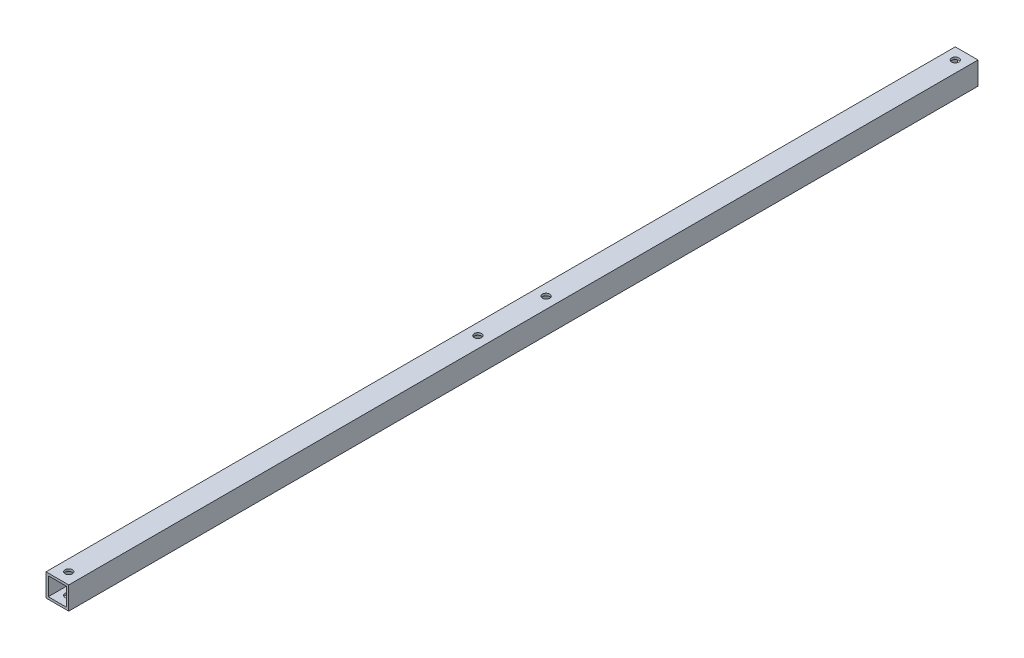
ISO-10303-21;
HEADER;
FILE_DESCRIPTION(('STEP AP214'),'2;1');
FILE_NAME('part.step','',(''),(''),'','','');
FILE_SCHEMA(('AUTOMOTIVE_DESIGN { 1 0 10303 214 1 1 1 1 }'));
ENDSEC;
DATA;
#1=APPLICATION_CONTEXT('core data for automotive mechanical design processes');
#2=APPLICATION_PROTOCOL_DEFINITION('international standard','automotive_design',2000,#1);
#3=PRODUCT_CONTEXT('',#1,'mechanical');
#4=PRODUCT('Part','Part','',(#3));
#5=PRODUCT_RELATED_PRODUCT_CATEGORY('part','',(#4));
#6=PRODUCT_DEFINITION_FORMATION('','',#4);
#7=PRODUCT_DEFINITION_CONTEXT('part definition',#1,'design');
#8=PRODUCT_DEFINITION('design','',#6,#7);
#9=PRODUCT_DEFINITION_SHAPE('','',#8);
#10=(LENGTH_UNIT() NAMED_UNIT(*) SI_UNIT(.MILLI.,.METRE.));
#11=(NAMED_UNIT(*) PLANE_ANGLE_UNIT() SI_UNIT($,.RADIAN.));
#12=(NAMED_UNIT(*) SI_UNIT($,.STERADIAN.) SOLID_ANGLE_UNIT());
#13=UNCERTAINTY_MEASURE_WITH_UNIT(LENGTH_MEASURE(1.E-05),#10,'distance_accuracy_value','');
#14=(GEOMETRIC_REPRESENTATION_CONTEXT(3) GLOBAL_UNCERTAINTY_ASSIGNED_CONTEXT((#13)) GLOBAL_UNIT_ASSIGNED_CONTEXT((#10,
#11,#12)) REPRESENTATION_CONTEXT('',''));
#15=CARTESIAN_POINT('',(0.,0.,0.));
#16=DIRECTION('',(0.,0.,1.));
#17=DIRECTION('',(1.,0.,0.));
#18=AXIS2_PLACEMENT_3D('',#15,#16,#17);
#19=CARTESIAN_POINT('',(0.,0.,399.7114317));
#20=DIRECTION('',(0.,0.,1.));
#21=DIRECTION('',(1.,0.,0.));
#22=AXIS2_PLACEMENT_3D('',#19,#20,#21);
#23=PLANE('',#22);
#24=DIRECTION('',(0.,1.,0.));
#25=VECTOR('',#24,1.);
#26=CARTESIAN_POINT('',(5.,5.,399.7114317));
#27=LINE('',#26,#25);
#28=CARTESIAN_POINT('',(5.,-5.,399.7114317));
#29=VERTEX_POINT('',#28);
#30=CARTESIAN_POINT('',(5.,5.,399.7114317));
#31=VERTEX_POINT('',#30);
#32=EDGE_CURVE('E138',#29,#31,#27,.T.);
#33=ORIENTED_EDGE('',*,*,#32,.T.);
#34=DIRECTION('',(-1.,0.,0.));
#35=VECTOR('',#34,1.);
#36=CARTESIAN_POINT('',(-5.,5.,399.7114317));
#37=LINE('',#36,#35);
#38=CARTESIAN_POINT('',(-5.,5.,399.7114317));
#39=VERTEX_POINT('',#38);
#40=EDGE_CURVE('E141',#31,#39,#37,.T.);
#41=ORIENTED_EDGE('',*,*,#40,.T.);
#42=DIRECTION('',(0.,-1.,0.));
#43=VECTOR('',#42,1.);
#44=CARTESIAN_POINT('',(-5.,5.,399.7114317));
#45=LINE('',#44,#43);
#46=CARTESIAN_POINT('',(-5.,-5.,399.7114317));
#47=VERTEX_POINT('',#46);
#48=EDGE_CURVE('E144',#39,#47,#45,.T.);
#49=ORIENTED_EDGE('',*,*,#48,.T.);
#50=DIRECTION('',(1.,0.,0.));
#51=VECTOR('',#50,1.);
#52=CARTESIAN_POINT('',(-5.,-5.,399.7114317));
#53=LINE('',#52,#51);
#54=EDGE_CURVE('E146',#47,#29,#53,.T.);
#55=ORIENTED_EDGE('',*,*,#54,.T.);
#56=EDGE_LOOP('',(#33,#41,#49,#55));
#57=FACE_BOUND('',#56,.T.);
#58=DIRECTION('',(0.,-1.,0.));
#59=VECTOR('',#58,1.);
#60=CARTESIAN_POINT('',(-4.,4.,399.7114317));
#61=LINE('',#60,#59);
#62=CARTESIAN_POINT('',(-4.,4.,399.7114317));
#63=VERTEX_POINT('',#62);
#64=CARTESIAN_POINT('',(-4.,-4.,399.7114317));
#65=VERTEX_POINT('',#64);
#66=EDGE_CURVE('E108',#63,#65,#61,.T.);
#67=ORIENTED_EDGE('',*,*,#66,.F.);
#68=DIRECTION('',(-1.,0.,0.));
#69=VECTOR('',#68,1.);
#70=CARTESIAN_POINT('',(-4.,4.,399.7114317));
#71=LINE('',#70,#69);
#72=CARTESIAN_POINT('',(4.,4.,399.7114317));
#73=VERTEX_POINT('',#72);
#74=EDGE_CURVE('E100',#73,#63,#71,.T.);
#75=ORIENTED_EDGE('',*,*,#74,.F.);
#76=DIRECTION('',(0.,1.,0.));
#77=VECTOR('',#76,1.);
#78=CARTESIAN_POINT('',(4.,4.,399.7114317));
#79=LINE('',#78,#77);
#80=CARTESIAN_POINT('',(4.,-4.,399.7114317));
#81=VERTEX_POINT('',#80);
#82=EDGE_CURVE('E122',#81,#73,#79,.T.);
#83=ORIENTED_EDGE('',*,*,#82,.F.);
#84=DIRECTION('',(1.,0.,0.));
#85=VECTOR('',#84,1.);
#86=CARTESIAN_POINT('',(-4.,-4.,399.7114317));
#87=LINE('',#86,#85);
#88=EDGE_CURVE('E120',#65,#81,#87,.T.);
#89=ORIENTED_EDGE('',*,*,#88,.F.);
#90=EDGE_LOOP('',(#67,#75,#83,#89));
#91=FACE_BOUND('',#90,.T.);
#92=ADVANCED_FACE('F33',(#57,#91),#23,.T.);
#93=CARTESIAN_POINT('',(0.,0.,0.));
#94=DIRECTION('',(0.,0.,1.));
#95=DIRECTION('',(1.,0.,0.));
#96=AXIS2_PLACEMENT_3D('',#93,#94,#95);
#97=PLANE('',#96);
#98=DIRECTION('',(0.,1.,0.));
#99=VECTOR('',#98,1.);
#100=CARTESIAN_POINT('',(5.,5.,0.));
#101=LINE('',#100,#99);
#102=CARTESIAN_POINT('',(5.,-5.,0.));
#103=VERTEX_POINT('',#102);
#104=CARTESIAN_POINT('',(5.,5.,0.));
#105=VERTEX_POINT('',#104);
#106=EDGE_CURVE('E116',#103,#105,#101,.T.);
#107=ORIENTED_EDGE('',*,*,#106,.F.);
#108=DIRECTION('',(1.,0.,0.));
#109=VECTOR('',#108,1.);
#110=CARTESIAN_POINT('',(-5.,-5.,0.));
#111=LINE('',#110,#109);
#112=CARTESIAN_POINT('',(-5.,-5.,0.));
#113=VERTEX_POINT('',#112);
#114=EDGE_CURVE('E142',#113,#103,#111,.T.);
#115=ORIENTED_EDGE('',*,*,#114,.F.);
#116=DIRECTION('',(0.,-1.,0.));
#117=VECTOR('',#116,1.);
#118=CARTESIAN_POINT('',(-5.,5.,0.));
#119=LINE('',#118,#117);
#120=CARTESIAN_POINT('',(-5.,5.,0.));
#121=VERTEX_POINT('',#120);
#122=EDGE_CURVE('E153',#121,#113,#119,.T.);
#123=ORIENTED_EDGE('',*,*,#122,.F.);
#124=DIRECTION('',(-1.,0.,0.));
#125=VECTOR('',#124,1.);
#126=CARTESIAN_POINT('',(-5.,5.,0.));
#127=LINE('',#126,#125);
#128=EDGE_CURVE('E151',#105,#121,#127,.T.);
#129=ORIENTED_EDGE('',*,*,#128,.F.);
#130=EDGE_LOOP('',(#107,#115,#123,#129));
#131=FACE_BOUND('',#130,.T.);
#132=DIRECTION('',(-1.,0.,0.));
#133=VECTOR('',#132,1.);
#134=CARTESIAN_POINT('',(-4.,4.,0.));
#135=LINE('',#134,#133);
#136=CARTESIAN_POINT('',(4.,4.,0.));
#137=VERTEX_POINT('',#136);
#138=CARTESIAN_POINT('',(-4.,4.,0.));
#139=VERTEX_POINT('',#138);
#140=EDGE_CURVE('E58',#137,#139,#135,.T.);
#141=ORIENTED_EDGE('',*,*,#140,.T.);
#142=DIRECTION('',(0.,-1.,0.));
#143=VECTOR('',#142,1.);
#144=CARTESIAN_POINT('',(-4.,4.,0.));
#145=LINE('',#144,#143);
#146=CARTESIAN_POINT('',(-4.,-4.,0.));
#147=VERTEX_POINT('',#146);
#148=EDGE_CURVE('E115',#139,#147,#145,.T.);
#149=ORIENTED_EDGE('',*,*,#148,.T.);
#150=DIRECTION('',(1.,0.,0.));
#151=VECTOR('',#150,1.);
#152=CARTESIAN_POINT('',(-4.,-4.,0.));
#153=LINE('',#152,#151);
#154=CARTESIAN_POINT('',(4.,-4.,0.));
#155=VERTEX_POINT('',#154);
#156=EDGE_CURVE('E130',#147,#155,#153,.T.);
#157=ORIENTED_EDGE('',*,*,#156,.T.);
#158=DIRECTION('',(0.,1.,0.));
#159=VECTOR('',#158,1.);
#160=CARTESIAN_POINT('',(4.,4.,0.));
#161=LINE('',#160,#159);
#162=EDGE_CURVE('E109',#155,#137,#161,.T.);
#163=ORIENTED_EDGE('',*,*,#162,.T.);
#164=EDGE_LOOP('',(#141,#149,#157,#163));
#165=FACE_BOUND('',#164,.T.);
#166=ADVANCED_FACE('F222',(#131,#165),#97,.F.);
#167=CARTESIAN_POINT('',(5.,5.,399.7114317));
#168=DIRECTION('',(-1.,0.,0.));
#169=DIRECTION('',(0.,-1.,0.));
#170=AXIS2_PLACEMENT_3D('',#167,#168,#169);
#171=PLANE('',#170);
#172=ORIENTED_EDGE('',*,*,#106,.T.);
#173=DIRECTION('',(0.,0.,-1.));
#174=VECTOR('',#173,1.);
#175=CARTESIAN_POINT('',(5.,5.,399.7114317));
#176=LINE('',#175,#174);
#177=EDGE_CURVE('E11',#31,#105,#176,.T.);
#178=ORIENTED_EDGE('',*,*,#177,.F.);
#179=ORIENTED_EDGE('',*,*,#32,.F.);
#180=DIRECTION('',(0.,0.,-1.));
#181=VECTOR('',#180,1.);
#182=CARTESIAN_POINT('',(5.,-5.,399.7114317));
#183=LINE('',#182,#181);
#184=EDGE_CURVE('E148',#29,#103,#183,.T.);
#185=ORIENTED_EDGE('',*,*,#184,.T.);
#186=EDGE_LOOP('',(#172,#178,#179,#185));
#187=FACE_BOUND('',#186,.T.);
#188=ADVANCED_FACE('F35',(#187),#171,.F.);
#189=CARTESIAN_POINT('',(-5.,5.,399.7114317));
#190=DIRECTION('',(0.,-1.,0.));
#191=DIRECTION('',(0.,0.,-1.));
#192=AXIS2_PLACEMENT_3D('',#189,#190,#191);
#193=PLANE('',#192);
#194=CARTESIAN_POINT('',(0.,5.,394.7114317));
#195=DIRECTION('',(0.,1.,0.));
#196=DIRECTION('',(0.,0.,1.));
#197=AXIS2_PLACEMENT_3D('',#194,#195,#196);
#198=CIRCLE('',#197,1.59999999999999);
#199=CARTESIAN_POINT('',(0.,5.,396.3114317));
#200=VERTEX_POINT('',#199);
#201=EDGE_CURVE('E171',#200,#200,#198,.T.);
#202=ORIENTED_EDGE('',*,*,#201,.F.);
#203=EDGE_LOOP('',(#202));
#204=FACE_BOUND('',#203,.T.);
#205=CARTESIAN_POINT('',(0.,5.,184.85571585));
#206=DIRECTION('',(0.,1.,0.));
#207=DIRECTION('',(0.,0.,1.));
#208=AXIS2_PLACEMENT_3D('',#205,#206,#207);
#209=CIRCLE('',#208,1.59999999999999);
#210=CARTESIAN_POINT('',(0.,5.,186.45571585));
#211=VERTEX_POINT('',#210);
#212=EDGE_CURVE('E252',#211,#211,#209,.T.);
#213=ORIENTED_EDGE('',*,*,#212,.F.);
#214=EDGE_LOOP('',(#213));
#215=FACE_BOUND('',#214,.T.);
#216=CARTESIAN_POINT('',(0.,5.,214.85571585));
#217=DIRECTION('',(0.,1.,0.));
#218=DIRECTION('',(0.,0.,1.));
#219=AXIS2_PLACEMENT_3D('',#216,#217,#218);
#220=CIRCLE('',#219,1.59999999999999);
#221=CARTESIAN_POINT('',(0.,5.,216.45571585));
#222=VERTEX_POINT('',#221);
#223=EDGE_CURVE('E256',#222,#222,#220,.T.);
#224=ORIENTED_EDGE('',*,*,#223,.F.);
#225=EDGE_LOOP('',(#224));
#226=FACE_BOUND('',#225,.T.);
#227=CARTESIAN_POINT('',(0.,5.,5.));
#228=DIRECTION('',(0.,1.,0.));
#229=DIRECTION('',(0.,0.,1.));
#230=AXIS2_PLACEMENT_3D('',#227,#228,#229);
#231=CIRCLE('',#230,1.6);
#232=CARTESIAN_POINT('',(0.,5.,6.6));
#233=VERTEX_POINT('',#232);
#234=EDGE_CURVE('E167',#233,#233,#231,.T.);
#235=ORIENTED_EDGE('',*,*,#234,.F.);
#236=EDGE_LOOP('',(#235));
#237=FACE_BOUND('',#236,.T.);
#238=ORIENTED_EDGE('',*,*,#128,.T.);
#239=DIRECTION('',(0.,0.,-1.));
#240=VECTOR('',#239,1.);
#241=CARTESIAN_POINT('',(-5.,5.,399.7114317));
#242=LINE('',#241,#240);
#243=EDGE_CURVE('E42',#39,#121,#242,.T.);
#244=ORIENTED_EDGE('',*,*,#243,.F.);
#245=ORIENTED_EDGE('',*,*,#40,.F.);
#246=ORIENTED_EDGE('',*,*,#177,.T.);
#247=EDGE_LOOP('',(#238,#244,#245,#246));
#248=FACE_BOUND('',#247,.T.);
#249=ADVANCED_FACE('F238',(#204,#215,#226,#237,#248),#193,.F.);
#250=CARTESIAN_POINT('',(-5.,5.,399.7114317));
#251=DIRECTION('',(1.,0.,0.));
#252=DIRECTION('',(0.,1.,0.));
#253=AXIS2_PLACEMENT_3D('',#250,#251,#252);
#254=PLANE('',#253);
#255=ORIENTED_EDGE('',*,*,#122,.T.);
#256=DIRECTION('',(0.,0.,-1.));
#257=VECTOR('',#256,1.);
#258=CARTESIAN_POINT('',(-5.,-5.,399.7114317));
#259=LINE('',#258,#257);
#260=EDGE_CURVE('E158',#47,#113,#259,.T.);
#261=ORIENTED_EDGE('',*,*,#260,.F.);
#262=ORIENTED_EDGE('',*,*,#48,.F.);
#263=ORIENTED_EDGE('',*,*,#243,.T.);
#264=EDGE_LOOP('',(#255,#261,#262,#263));
#265=FACE_BOUND('',#264,.T.);
#266=ADVANCED_FACE('F235',(#265),#254,.F.);
#267=CARTESIAN_POINT('',(-5.,-5.,399.7114317));
#268=DIRECTION('',(0.,1.,0.));
#269=DIRECTION('',(0.,0.,1.));
#270=AXIS2_PLACEMENT_3D('',#267,#268,#269);
#271=PLANE('',#270);
#272=CARTESIAN_POINT('',(0.,-5.,394.7114317));
#273=DIRECTION('',(0.,1.,0.));
#274=DIRECTION('',(0.,0.,1.));
#275=AXIS2_PLACEMENT_3D('',#272,#273,#274);
#276=CIRCLE('',#275,1.59999999999999);
#277=CARTESIAN_POINT('',(0.,-5.,396.3114317));
#278=VERTEX_POINT('',#277);
#279=EDGE_CURVE('E194',#278,#278,#276,.T.);
#280=ORIENTED_EDGE('',*,*,#279,.T.);
#281=EDGE_LOOP('',(#280));
#282=FACE_BOUND('',#281,.T.);
#283=CARTESIAN_POINT('',(0.,-5.,184.85571585));
#284=DIRECTION('',(0.,1.,0.));
#285=DIRECTION('',(0.,0.,1.));
#286=AXIS2_PLACEMENT_3D('',#283,#284,#285);
#287=CIRCLE('',#286,1.59999999999999);
#288=CARTESIAN_POINT('',(0.,-5.,186.45571585));
#289=VERTEX_POINT('',#288);
#290=EDGE_CURVE('E179',#289,#289,#287,.T.);
#291=ORIENTED_EDGE('',*,*,#290,.T.);
#292=EDGE_LOOP('',(#291));
#293=FACE_BOUND('',#292,.T.);
#294=CARTESIAN_POINT('',(0.,-5.,214.85571585));
#295=DIRECTION('',(0.,1.,0.));
#296=DIRECTION('',(0.,0.,1.));
#297=AXIS2_PLACEMENT_3D('',#294,#295,#296);
#298=CIRCLE('',#297,1.59999999999999);
#299=CARTESIAN_POINT('',(0.,-5.,216.45571585));
#300=VERTEX_POINT('',#299);
#301=EDGE_CURVE('E175',#300,#300,#298,.T.);
#302=ORIENTED_EDGE('',*,*,#301,.T.);
#303=EDGE_LOOP('',(#302));
#304=FACE_BOUND('',#303,.T.);
#305=CARTESIAN_POINT('',(0.,-5.,5.));
#306=DIRECTION('',(0.,1.,0.));
#307=DIRECTION('',(0.,0.,1.));
#308=AXIS2_PLACEMENT_3D('',#305,#306,#307);
#309=CIRCLE('',#308,1.6);
#310=CARTESIAN_POINT('',(0.,-5.,6.6));
#311=VERTEX_POINT('',#310);
#312=EDGE_CURVE('E128',#311,#311,#309,.T.);
#313=ORIENTED_EDGE('',*,*,#312,.T.);
#314=EDGE_LOOP('',(#313));
#315=FACE_BOUND('',#314,.T.);
#316=ORIENTED_EDGE('',*,*,#114,.T.);
#317=ORIENTED_EDGE('',*,*,#184,.F.);
#318=ORIENTED_EDGE('',*,*,#54,.F.);
#319=ORIENTED_EDGE('',*,*,#260,.T.);
#320=EDGE_LOOP('',(#316,#317,#318,#319));
#321=FACE_BOUND('',#320,.T.);
#322=ADVANCED_FACE('F203',(#282,#293,#304,#315,#321),#271,.F.);
#323=CARTESIAN_POINT('',(-4.,4.,399.7114317));
#324=DIRECTION('',(0.,-1.,0.));
#325=DIRECTION('',(0.,0.,-1.));
#326=AXIS2_PLACEMENT_3D('',#323,#324,#325);
#327=PLANE('',#326);
#328=CARTESIAN_POINT('',(0.,4.,394.7114317));
#329=DIRECTION('',(0.,-1.,0.));
#330=DIRECTION('',(0.,0.,-1.));
#331=AXIS2_PLACEMENT_3D('',#328,#329,#330);
#332=CIRCLE('',#331,1.59999999999999);
#333=CARTESIAN_POINT('',(0.,4.,393.1114317));
#334=VERTEX_POINT('',#333);
#335=EDGE_CURVE('E191',#334,#334,#332,.T.);
#336=ORIENTED_EDGE('',*,*,#335,.F.);
#337=EDGE_LOOP('',(#336));
#338=FACE_BOUND('',#337,.T.);
#339=CARTESIAN_POINT('',(0.,4.,184.85571585));
#340=DIRECTION('',(0.,-1.,0.));
#341=DIRECTION('',(0.,0.,-1.));
#342=AXIS2_PLACEMENT_3D('',#339,#340,#341);
#343=CIRCLE('',#342,1.59999999999999);
#344=CARTESIAN_POINT('',(0.,4.,183.25571585));
#345=VERTEX_POINT('',#344);
#346=EDGE_CURVE('E174',#345,#345,#343,.T.);
#347=ORIENTED_EDGE('',*,*,#346,.F.);
#348=EDGE_LOOP('',(#347));
#349=FACE_BOUND('',#348,.T.);
#350=CARTESIAN_POINT('',(0.,4.,214.85571585));
#351=DIRECTION('',(0.,-1.,0.));
#352=DIRECTION('',(0.,0.,-1.));
#353=AXIS2_PLACEMENT_3D('',#350,#351,#352);
#354=CIRCLE('',#353,1.59999999999999);
#355=CARTESIAN_POINT('',(0.,4.,213.25571585));
#356=VERTEX_POINT('',#355);
#357=EDGE_CURVE('E170',#356,#356,#354,.T.);
#358=ORIENTED_EDGE('',*,*,#357,.F.);
#359=EDGE_LOOP('',(#358));
#360=FACE_BOUND('',#359,.T.);
#361=CARTESIAN_POINT('',(0.,4.,5.));
#362=DIRECTION('',(0.,-1.,0.));
#363=DIRECTION('',(0.,0.,-1.));
#364=AXIS2_PLACEMENT_3D('',#361,#362,#363);
#365=CIRCLE('',#364,1.6);
#366=CARTESIAN_POINT('',(0.,4.,3.4));
#367=VERTEX_POINT('',#366);
#368=EDGE_CURVE('E166',#367,#367,#365,.T.);
#369=ORIENTED_EDGE('',*,*,#368,.F.);
#370=EDGE_LOOP('',(#369));
#371=FACE_BOUND('',#370,.T.);
#372=ORIENTED_EDGE('',*,*,#140,.F.);
#373=DIRECTION('',(0.,0.,-1.));
#374=VECTOR('',#373,1.);
#375=CARTESIAN_POINT('',(4.,4.,399.7114317));
#376=LINE('',#375,#374);
#377=EDGE_CURVE('E104',#73,#137,#376,.T.);
#378=ORIENTED_EDGE('',*,*,#377,.F.);
#379=ORIENTED_EDGE('',*,*,#74,.T.);
#380=DIRECTION('',(0.,0.,-1.));
#381=VECTOR('',#380,1.);
#382=CARTESIAN_POINT('',(-4.,4.,399.7114317));
#383=LINE('',#382,#381);
#384=EDGE_CURVE('E103',#63,#139,#383,.T.);
#385=ORIENTED_EDGE('',*,*,#384,.T.);
#386=EDGE_LOOP('',(#372,#378,#379,#385));
#387=FACE_BOUND('',#386,.T.);
#388=ADVANCED_FACE('F102',(#338,#349,#360,#371,#387),#327,.T.);
#389=CARTESIAN_POINT('',(-4.,4.,399.7114317));
#390=DIRECTION('',(1.,0.,0.));
#391=DIRECTION('',(0.,1.,0.));
#392=AXIS2_PLACEMENT_3D('',#389,#390,#391);
#393=PLANE('',#392);
#394=ORIENTED_EDGE('',*,*,#148,.F.);
#395=ORIENTED_EDGE('',*,*,#384,.F.);
#396=ORIENTED_EDGE('',*,*,#66,.T.);
#397=DIRECTION('',(0.,0.,-1.));
#398=VECTOR('',#397,1.);
#399=CARTESIAN_POINT('',(-4.,-4.,399.7114317));
#400=LINE('',#399,#398);
#401=EDGE_CURVE('E117',#65,#147,#400,.T.);
#402=ORIENTED_EDGE('',*,*,#401,.T.);
#403=EDGE_LOOP('',(#394,#395,#396,#402));
#404=FACE_BOUND('',#403,.T.);
#405=ADVANCED_FACE('F112',(#404),#393,.T.);
#406=CARTESIAN_POINT('',(-4.,-4.,399.7114317));
#407=DIRECTION('',(0.,1.,0.));
#408=DIRECTION('',(-1.,0.,0.));
#409=AXIS2_PLACEMENT_3D('',#406,#407,#408);
#410=PLANE('',#409);
#411=CARTESIAN_POINT('',(0.,-4.,394.7114317));
#412=DIRECTION('',(0.,1.,0.));
#413=DIRECTION('',(-1.,0.,0.));
#414=AXIS2_PLACEMENT_3D('',#411,#412,#413);
#415=CIRCLE('',#414,1.59999999999999);
#416=CARTESIAN_POINT('',(-1.59999999999999,-4.,394.7114317));
#417=VERTEX_POINT('',#416);
#418=EDGE_CURVE('E37',#417,#417,#415,.T.);
#419=ORIENTED_EDGE('',*,*,#418,.F.);
#420=EDGE_LOOP('',(#419));
#421=FACE_BOUND('',#420,.T.);
#422=CARTESIAN_POINT('',(0.,-4.,184.85571585));
#423=DIRECTION('',(0.,1.,0.));
#424=DIRECTION('',(-1.,0.,0.));
#425=AXIS2_PLACEMENT_3D('',#422,#423,#424);
#426=CIRCLE('',#425,1.59999999999999);
#427=CARTESIAN_POINT('',(-1.59999999999999,-4.,184.85571585));
#428=VERTEX_POINT('',#427);
#429=EDGE_CURVE('E172',#428,#428,#426,.T.);
#430=ORIENTED_EDGE('',*,*,#429,.F.);
#431=EDGE_LOOP('',(#430));
#432=FACE_BOUND('',#431,.T.);
#433=CARTESIAN_POINT('',(0.,-4.,214.85571585));
#434=DIRECTION('',(0.,1.,0.));
#435=DIRECTION('',(-1.,0.,0.));
#436=AXIS2_PLACEMENT_3D('',#433,#434,#435);
#437=CIRCLE('',#436,1.59999999999999);
#438=CARTESIAN_POINT('',(-1.59999999999999,-4.,214.85571585));
#439=VERTEX_POINT('',#438);
#440=EDGE_CURVE('E168',#439,#439,#437,.T.);
#441=ORIENTED_EDGE('',*,*,#440,.F.);
#442=EDGE_LOOP('',(#441));
#443=FACE_BOUND('',#442,.T.);
#444=CARTESIAN_POINT('',(0.,-4.,5.));
#445=DIRECTION('',(0.,1.,0.));
#446=DIRECTION('',(-1.,0.,0.));
#447=AXIS2_PLACEMENT_3D('',#444,#445,#446);
#448=CIRCLE('',#447,1.6);
#449=CARTESIAN_POINT('',(-1.6,-4.,5.));
#450=VERTEX_POINT('',#449);
#451=EDGE_CURVE('E163',#450,#450,#448,.T.);
#452=ORIENTED_EDGE('',*,*,#451,.F.);
#453=EDGE_LOOP('',(#452));
#454=FACE_BOUND('',#453,.T.);
#455=ORIENTED_EDGE('',*,*,#156,.F.);
#456=ORIENTED_EDGE('',*,*,#401,.F.);
#457=ORIENTED_EDGE('',*,*,#88,.T.);
#458=DIRECTION('',(0.,0.,-1.));
#459=VECTOR('',#458,1.);
#460=CARTESIAN_POINT('',(4.,-4.,399.7114317));
#461=LINE('',#460,#459);
#462=EDGE_CURVE('E50',#81,#155,#461,.T.);
#463=ORIENTED_EDGE('',*,*,#462,.T.);
#464=EDGE_LOOP('',(#455,#456,#457,#463));
#465=FACE_BOUND('',#464,.T.);
#466=ADVANCED_FACE('F218',(#421,#432,#443,#454,#465),#410,.T.);
#467=CARTESIAN_POINT('',(4.,4.,399.7114317));
#468=DIRECTION('',(-1.,0.,0.));
#469=DIRECTION('',(0.,-1.,0.));
#470=AXIS2_PLACEMENT_3D('',#467,#468,#469);
#471=PLANE('',#470);
#472=ORIENTED_EDGE('',*,*,#162,.F.);
#473=ORIENTED_EDGE('',*,*,#462,.F.);
#474=ORIENTED_EDGE('',*,*,#82,.T.);
#475=ORIENTED_EDGE('',*,*,#377,.T.);
#476=EDGE_LOOP('',(#472,#473,#474,#475));
#477=FACE_BOUND('',#476,.T.);
#478=ADVANCED_FACE('F209',(#477),#471,.T.);
#479=CARTESIAN_POINT('',(0.,-403.37168574,5.));
#480=DIRECTION('',(0.,1.,0.));
#481=DIRECTION('',(0.,0.,1.));
#482=AXIS2_PLACEMENT_3D('',#479,#480,#481);
#483=CYLINDRICAL_SURFACE('',#482,1.6);
#484=ORIENTED_EDGE('',*,*,#451,.T.);
#485=EDGE_LOOP('',(#484));
#486=FACE_BOUND('',#485,.T.);
#487=ORIENTED_EDGE('',*,*,#312,.F.);
#488=EDGE_LOOP('',(#487));
#489=FACE_BOUND('',#488,.T.);
#490=ADVANCED_FACE('F206',(#486,#489),#483,.F.);
#491=ORIENTED_EDGE('',*,*,#368,.T.);
#492=EDGE_LOOP('',(#491));
#493=FACE_BOUND('',#492,.T.);
#494=ORIENTED_EDGE('',*,*,#234,.T.);
#495=EDGE_LOOP('',(#494));
#496=FACE_BOUND('',#495,.T.);
#497=ADVANCED_FACE('F208',(#493,#496),#483,.F.);
#498=CARTESIAN_POINT('',(0.,-403.37168574,214.85571585));
#499=DIRECTION('',(0.,1.,0.));
#500=DIRECTION('',(0.,0.,1.));
#501=AXIS2_PLACEMENT_3D('',#498,#499,#500);
#502=CYLINDRICAL_SURFACE('',#501,1.59999999999999);
#503=ORIENTED_EDGE('',*,*,#440,.T.);
#504=EDGE_LOOP('',(#503));
#505=FACE_BOUND('',#504,.T.);
#506=ORIENTED_EDGE('',*,*,#301,.F.);
#507=EDGE_LOOP('',(#506));
#508=FACE_BOUND('',#507,.T.);
#509=ADVANCED_FACE('F216',(#505,#508),#502,.F.);
#510=CARTESIAN_POINT('',(0.,-403.37168574,184.85571585));
#511=DIRECTION('',(0.,1.,0.));
#512=DIRECTION('',(0.,0.,1.));
#513=AXIS2_PLACEMENT_3D('',#510,#511,#512);
#514=CYLINDRICAL_SURFACE('',#513,1.59999999999999);
#515=ORIENTED_EDGE('',*,*,#429,.T.);
#516=EDGE_LOOP('',(#515));
#517=FACE_BOUND('',#516,.T.);
#518=ORIENTED_EDGE('',*,*,#290,.F.);
#519=EDGE_LOOP('',(#518));
#520=FACE_BOUND('',#519,.T.);
#521=ADVANCED_FACE('F288',(#517,#520),#514,.F.);
#522=CARTESIAN_POINT('',(0.,-403.37168574,394.7114317));
#523=DIRECTION('',(0.,1.,0.));
#524=DIRECTION('',(0.,0.,1.));
#525=AXIS2_PLACEMENT_3D('',#522,#523,#524);
#526=CYLINDRICAL_SURFACE('',#525,1.59999999999999);
#527=ORIENTED_EDGE('',*,*,#418,.T.);
#528=EDGE_LOOP('',(#527));
#529=FACE_BOUND('',#528,.T.);
#530=ORIENTED_EDGE('',*,*,#279,.F.);
#531=EDGE_LOOP('',(#530));
#532=FACE_BOUND('',#531,.T.);
#533=ADVANCED_FACE('F293',(#529,#532),#526,.F.);
#534=ORIENTED_EDGE('',*,*,#357,.T.);
#535=EDGE_LOOP('',(#534));
#536=FACE_BOUND('',#535,.T.);
#537=ORIENTED_EDGE('',*,*,#223,.T.);
#538=EDGE_LOOP('',(#537));
#539=FACE_BOUND('',#538,.T.);
#540=ADVANCED_FACE('F289',(#536,#539),#502,.F.);
#541=ORIENTED_EDGE('',*,*,#346,.T.);
#542=EDGE_LOOP('',(#541));
#543=FACE_BOUND('',#542,.T.);
#544=ORIENTED_EDGE('',*,*,#212,.T.);
#545=EDGE_LOOP('',(#544));
#546=FACE_BOUND('',#545,.T.);
#547=ADVANCED_FACE('F295',(#543,#546),#514,.F.);
#548=ORIENTED_EDGE('',*,*,#335,.T.);
#549=EDGE_LOOP('',(#548));
#550=FACE_BOUND('',#549,.T.);
#551=ORIENTED_EDGE('',*,*,#201,.T.);
#552=EDGE_LOOP('',(#551));
#553=FACE_BOUND('',#552,.T.);
#554=ADVANCED_FACE('F302',(#550,#553),#526,.F.);
#555=CLOSED_SHELL('',(#92,#166,#188,#249,#266,#322,#388,#405,#466,#478,#490,#497,#509,#521,#533,
#540,#547,#554));
#556=MANIFOLD_SOLID_BREP('B2',#555);
#557=ADVANCED_BREP_SHAPE_REPRESENTATION('',(#18,#556),#14);
#558=SHAPE_DEFINITION_REPRESENTATION(#9,#557);
ENDSEC;
END-ISO-10303-21;
